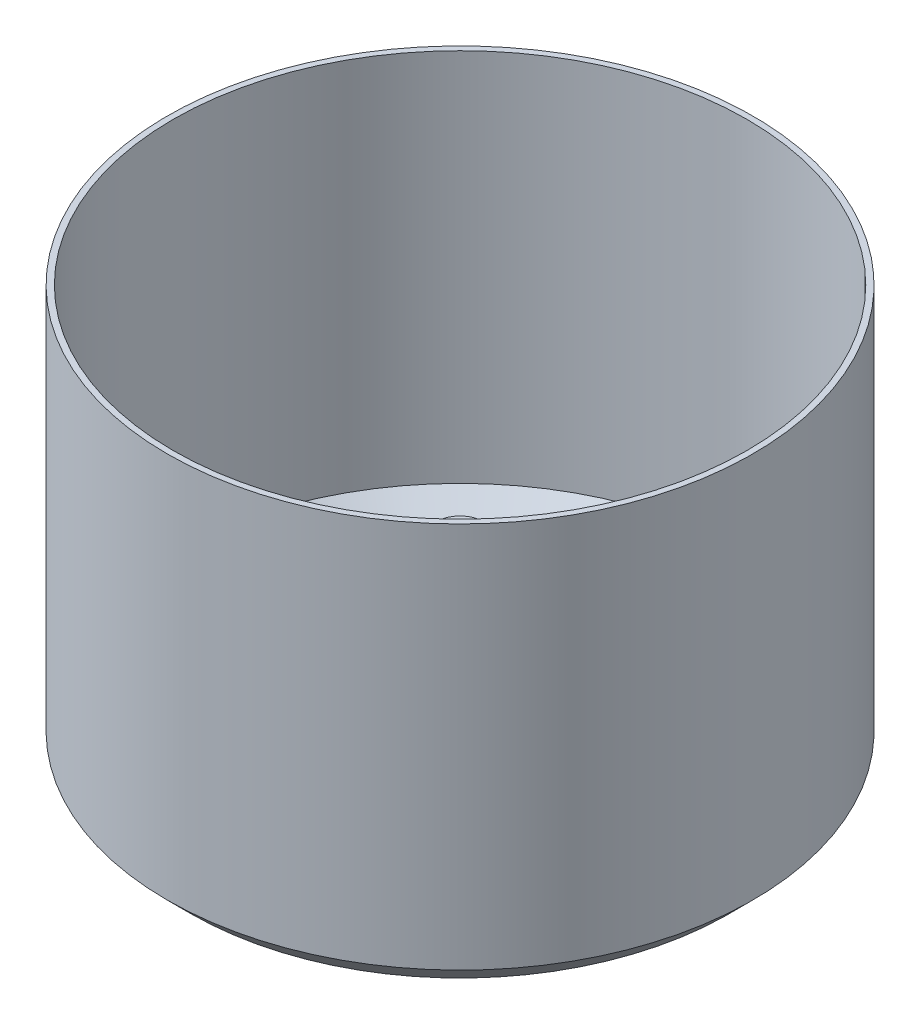
ISO-10303-21;
HEADER;
FILE_DESCRIPTION(('STEP AP214'),'2;1');
FILE_NAME('part.step','',(''),(''),'','','');
FILE_SCHEMA(('AUTOMOTIVE_DESIGN { 1 0 10303 214 1 1 1 1 }'));
ENDSEC;
DATA;
#1=APPLICATION_CONTEXT('core data for automotive mechanical design processes');
#2=APPLICATION_PROTOCOL_DEFINITION('international standard','automotive_design',2000,#1);
#3=PRODUCT_CONTEXT('',#1,'mechanical');
#4=PRODUCT('Part','Part','',(#3));
#5=PRODUCT_RELATED_PRODUCT_CATEGORY('part','',(#4));
#6=PRODUCT_DEFINITION_FORMATION('','',#4);
#7=PRODUCT_DEFINITION_CONTEXT('part definition',#1,'design');
#8=PRODUCT_DEFINITION('design','',#6,#7);
#9=PRODUCT_DEFINITION_SHAPE('','',#8);
#10=(LENGTH_UNIT() NAMED_UNIT(*) SI_UNIT(.MILLI.,.METRE.));
#11=(NAMED_UNIT(*) PLANE_ANGLE_UNIT() SI_UNIT($,.RADIAN.));
#12=(NAMED_UNIT(*) SI_UNIT($,.STERADIAN.) SOLID_ANGLE_UNIT());
#13=UNCERTAINTY_MEASURE_WITH_UNIT(LENGTH_MEASURE(1.E-05),#10,'distance_accuracy_value','');
#14=(GEOMETRIC_REPRESENTATION_CONTEXT(3) GLOBAL_UNCERTAINTY_ASSIGNED_CONTEXT((#13)) GLOBAL_UNIT_ASSIGNED_CONTEXT((#10,
#11,#12)) REPRESENTATION_CONTEXT('',''));
#15=CARTESIAN_POINT('',(0.,0.,0.));
#16=DIRECTION('',(0.,0.,1.));
#17=DIRECTION('',(1.,0.,0.));
#18=AXIS2_PLACEMENT_3D('',#15,#16,#17);
#19=CARTESIAN_POINT('',(0.,70.,0.));
#20=DIRECTION('',(0.,-1.,0.));
#21=DIRECTION('',(0.,0.,-1.));
#22=AXIS2_PLACEMENT_3D('',#19,#20,#21);
#23=CYLINDRICAL_SURFACE('',#22,49.);
#24=CARTESIAN_POINT('',(0.,6.00000000000002,0.));
#25=DIRECTION('',(0.,-1.,0.));
#26=DIRECTION('',(0.,0.,-1.));
#27=AXIS2_PLACEMENT_3D('',#24,#25,#26);
#28=CIRCLE('',#27,49.);
#29=CARTESIAN_POINT('',(0.,6.00000000000002,-49.));
#30=VERTEX_POINT('',#29);
#31=EDGE_CURVE('E107',#30,#30,#28,.T.);
#32=ORIENTED_EDGE('',*,*,#31,.T.);
#33=EDGE_LOOP('',(#32));
#34=FACE_BOUND('',#33,.T.);
#35=CARTESIAN_POINT('',(0.,70.,0.));
#36=DIRECTION('',(0.,1.,0.));
#37=DIRECTION('',(0.,0.,1.));
#38=AXIS2_PLACEMENT_3D('',#35,#36,#37);
#39=CIRCLE('',#38,49.);
#40=CARTESIAN_POINT('',(0.,70.,49.));
#41=VERTEX_POINT('',#40);
#42=EDGE_CURVE('E113',#41,#41,#39,.T.);
#43=ORIENTED_EDGE('',*,*,#42,.T.);
#44=EDGE_LOOP('',(#43));
#45=FACE_BOUND('',#44,.T.);
#46=ADVANCED_FACE('F41',(#34,#45),#23,.F.);
#47=CARTESIAN_POINT('',(0.,70.,0.));
#48=DIRECTION('',(0.,1.,0.));
#49=DIRECTION('',(0.,0.,1.));
#50=AXIS2_PLACEMENT_3D('',#47,#48,#49);
#51=PLANE('',#50);
#52=CARTESIAN_POINT('',(0.,70.,0.));
#53=DIRECTION('',(0.,1.,0.));
#54=DIRECTION('',(0.,0.,1.));
#55=AXIS2_PLACEMENT_3D('',#52,#53,#54);
#56=CIRCLE('',#55,50.);
#57=CARTESIAN_POINT('',(0.,70.,50.));
#58=VERTEX_POINT('',#57);
#59=EDGE_CURVE('E110',#58,#58,#56,.T.);
#60=ORIENTED_EDGE('',*,*,#59,.T.);
#61=EDGE_LOOP('',(#60));
#62=FACE_BOUND('',#61,.T.);
#63=ORIENTED_EDGE('',*,*,#42,.F.);
#64=EDGE_LOOP('',(#63));
#65=FACE_BOUND('',#64,.T.);
#66=ADVANCED_FACE('F118',(#62,#65),#51,.T.);
#67=CARTESIAN_POINT('',(0.,0.,0.));
#68=DIRECTION('',(0.,1.,0.));
#69=DIRECTION('',(0.,0.,1.));
#70=AXIS2_PLACEMENT_3D('',#67,#68,#69);
#71=PLANE('',#70);
#72=CARTESIAN_POINT('',(0.,0.,0.));
#73=DIRECTION('',(0.,1.,0.));
#74=DIRECTION('',(0.,0.,1.));
#75=AXIS2_PLACEMENT_3D('',#72,#73,#74);
#76=CIRCLE('',#75,46.);
#77=CARTESIAN_POINT('',(0.,0.,46.));
#78=VERTEX_POINT('',#77);
#79=EDGE_CURVE('E98',#78,#78,#76,.F.);
#80=ORIENTED_EDGE('',*,*,#79,.T.);
#81=EDGE_LOOP('',(#80));
#82=FACE_BOUND('',#81,.T.);
#83=ADVANCED_FACE('F120',(#82),#71,.F.);
#84=CARTESIAN_POINT('',(0.,70.,0.));
#85=DIRECTION('',(0.,-1.,0.));
#86=DIRECTION('',(0.,0.,-1.));
#87=AXIS2_PLACEMENT_3D('',#84,#85,#86);
#88=CYLINDRICAL_SURFACE('',#87,50.);
#89=CARTESIAN_POINT('',(0.,4.,0.));
#90=DIRECTION('',(0.,1.,0.));
#91=DIRECTION('',(0.,0.,1.));
#92=AXIS2_PLACEMENT_3D('',#89,#90,#91);
#93=CIRCLE('',#92,50.);
#94=CARTESIAN_POINT('',(0.,4.,50.));
#95=VERTEX_POINT('',#94);
#96=EDGE_CURVE('E101',#95,#95,#93,.T.);
#97=ORIENTED_EDGE('',*,*,#96,.T.);
#98=EDGE_LOOP('',(#97));
#99=FACE_BOUND('',#98,.T.);
#100=ORIENTED_EDGE('',*,*,#59,.F.);
#101=EDGE_LOOP('',(#100));
#102=FACE_BOUND('',#101,.T.);
#103=ADVANCED_FACE('F127',(#99,#102),#88,.T.);
#104=CARTESIAN_POINT('',(0.,2.,0.));
#105=DIRECTION('',(0.,-1.,0.));
#106=DIRECTION('',(0.,0.,-1.));
#107=AXIS2_PLACEMENT_3D('',#104,#105,#106);
#108=PLANE('',#107);
#109=CARTESIAN_POINT('',(21.,2.,21.));
#110=DIRECTION('',(0.,-1.,0.));
#111=DIRECTION('',(0.,0.,-1.));
#112=AXIS2_PLACEMENT_3D('',#109,#110,#111);
#113=CIRCLE('',#112,5.99999999999998);
#114=CARTESIAN_POINT('',(21.,2.,15.));
#115=VERTEX_POINT('',#114);
#116=EDGE_CURVE('E57',#115,#115,#113,.T.);
#117=ORIENTED_EDGE('',*,*,#116,.T.);
#118=EDGE_LOOP('',(#117));
#119=FACE_BOUND('',#118,.T.);
#120=CARTESIAN_POINT('',(21.,2.,-21.));
#121=DIRECTION('',(0.,-1.,0.));
#122=DIRECTION('',(0.,0.,-1.));
#123=AXIS2_PLACEMENT_3D('',#120,#121,#122);
#124=CIRCLE('',#123,5.99999999999998);
#125=CARTESIAN_POINT('',(21.,2.,-27.));
#126=VERTEX_POINT('',#125);
#127=EDGE_CURVE('E62',#126,#126,#124,.T.);
#128=ORIENTED_EDGE('',*,*,#127,.T.);
#129=EDGE_LOOP('',(#128));
#130=FACE_BOUND('',#129,.T.);
#131=CARTESIAN_POINT('',(-21.,2.,21.));
#132=DIRECTION('',(0.,-1.,0.));
#133=DIRECTION('',(0.,0.,-1.));
#134=AXIS2_PLACEMENT_3D('',#131,#132,#133);
#135=CIRCLE('',#134,5.99999999999998);
#136=CARTESIAN_POINT('',(-21.,2.,15.));
#137=VERTEX_POINT('',#136);
#138=EDGE_CURVE('E65',#137,#137,#135,.T.);
#139=ORIENTED_EDGE('',*,*,#138,.T.);
#140=EDGE_LOOP('',(#139));
#141=FACE_BOUND('',#140,.T.);
#142=CARTESIAN_POINT('',(-21.,2.,-21.));
#143=DIRECTION('',(0.,-1.,0.));
#144=DIRECTION('',(0.,0.,-1.));
#145=AXIS2_PLACEMENT_3D('',#142,#143,#144);
#146=CIRCLE('',#145,5.99999999999998);
#147=CARTESIAN_POINT('',(-21.,2.,-27.));
#148=VERTEX_POINT('',#147);
#149=EDGE_CURVE('E68',#148,#148,#146,.T.);
#150=ORIENTED_EDGE('',*,*,#149,.T.);
#151=EDGE_LOOP('',(#150));
#152=FACE_BOUND('',#151,.T.);
#153=CARTESIAN_POINT('',(0.,2.,0.));
#154=DIRECTION('',(0.,-1.,0.));
#155=DIRECTION('',(0.,0.,-1.));
#156=AXIS2_PLACEMENT_3D('',#153,#154,#155);
#157=CIRCLE('',#156,45.);
#158=CARTESIAN_POINT('',(0.,2.,-45.));
#159=VERTEX_POINT('',#158);
#160=EDGE_CURVE('E104',#159,#159,#157,.F.);
#161=ORIENTED_EDGE('',*,*,#160,.T.);
#162=EDGE_LOOP('',(#161));
#163=FACE_BOUND('',#162,.T.);
#164=ADVANCED_FACE('F136',(#119,#130,#141,#152,#163),#108,.F.);
#165=CARTESIAN_POINT('',(0.,6.00000000000002,0.));
#166=DIRECTION('',(0.,1.,0.));
#167=DIRECTION('',(0.,0.,1.));
#168=AXIS2_PLACEMENT_3D('',#165,#166,#167);
#169=CONICAL_SURFACE('',#168,49.,0.785398163397444);
#170=ORIENTED_EDGE('',*,*,#160,.F.);
#171=EDGE_LOOP('',(#170));
#172=FACE_BOUND('',#171,.T.);
#173=ORIENTED_EDGE('',*,*,#31,.F.);
#174=EDGE_LOOP('',(#173));
#175=FACE_BOUND('',#174,.T.);
#176=ADVANCED_FACE('F139',(#172,#175),#169,.F.);
#177=CARTESIAN_POINT('',(0.,4.,0.));
#178=DIRECTION('',(0.,1.,0.));
#179=DIRECTION('',(0.,0.,1.));
#180=AXIS2_PLACEMENT_3D('',#177,#178,#179);
#181=CONICAL_SURFACE('',#180,50.,0.785398163397452);
#182=ORIENTED_EDGE('',*,*,#79,.F.);
#183=EDGE_LOOP('',(#182));
#184=FACE_BOUND('',#183,.T.);
#185=ORIENTED_EDGE('',*,*,#96,.F.);
#186=EDGE_LOOP('',(#185));
#187=FACE_BOUND('',#186,.T.);
#188=ADVANCED_FACE('F145',(#184,#187),#181,.T.);
#189=CARTESIAN_POINT('',(-21.,12.,-21.));
#190=DIRECTION('',(0.,-1.,0.));
#191=DIRECTION('',(0.,0.,-1.));
#192=AXIS2_PLACEMENT_3D('',#189,#190,#191);
#193=CYLINDRICAL_SURFACE('',#192,5.);
#194=CARTESIAN_POINT('',(-21.,2.99999999999997,-21.));
#195=DIRECTION('',(0.,-1.,0.));
#196=DIRECTION('',(0.,0.,-1.));
#197=AXIS2_PLACEMENT_3D('',#194,#195,#196);
#198=CIRCLE('',#197,5.);
#199=CARTESIAN_POINT('',(-21.,2.99999999999997,-26.));
#200=VERTEX_POINT('',#199);
#201=EDGE_CURVE('E10',#200,#200,#198,.F.);
#202=ORIENTED_EDGE('',*,*,#201,.T.);
#203=EDGE_LOOP('',(#202));
#204=FACE_BOUND('',#203,.T.);
#205=CARTESIAN_POINT('',(-21.,11.,-21.));
#206=DIRECTION('',(0.,1.,0.));
#207=DIRECTION('',(0.,0.,1.));
#208=AXIS2_PLACEMENT_3D('',#205,#206,#207);
#209=CIRCLE('',#208,5.);
#210=CARTESIAN_POINT('',(-21.,11.,-16.));
#211=VERTEX_POINT('',#210);
#212=EDGE_CURVE('E74',#211,#211,#209,.F.);
#213=ORIENTED_EDGE('',*,*,#212,.T.);
#214=EDGE_LOOP('',(#213));
#215=FACE_BOUND('',#214,.T.);
#216=ADVANCED_FACE('F152',(#204,#215),#193,.T.);
#217=CARTESIAN_POINT('',(-21.,12.,-21.));
#218=DIRECTION('',(0.,1.,0.));
#219=DIRECTION('',(0.,0.,1.));
#220=AXIS2_PLACEMENT_3D('',#217,#218,#219);
#221=PLANE('',#220);
#222=CARTESIAN_POINT('',(-21.,12.,-21.));
#223=DIRECTION('',(0.,1.,0.));
#224=DIRECTION('',(0.,0.,1.));
#225=AXIS2_PLACEMENT_3D('',#222,#223,#224);
#226=CIRCLE('',#225,3.99999999999999);
#227=CARTESIAN_POINT('',(-21.,12.,-17.));
#228=VERTEX_POINT('',#227);
#229=EDGE_CURVE('E77',#228,#228,#226,.T.);
#230=ORIENTED_EDGE('',*,*,#229,.T.);
#231=EDGE_LOOP('',(#230));
#232=FACE_BOUND('',#231,.T.);
#233=ADVANCED_FACE('F223',(#232),#221,.T.);
#234=CARTESIAN_POINT('',(21.,12.,-21.));
#235=DIRECTION('',(0.,-1.,0.));
#236=DIRECTION('',(0.,0.,-1.));
#237=AXIS2_PLACEMENT_3D('',#234,#235,#236);
#238=CYLINDRICAL_SURFACE('',#237,5.);
#239=CARTESIAN_POINT('',(21.,2.99999999999997,-21.));
#240=DIRECTION('',(0.,-1.,0.));
#241=DIRECTION('',(0.,0.,-1.));
#242=AXIS2_PLACEMENT_3D('',#239,#240,#241);
#243=CIRCLE('',#242,5.);
#244=CARTESIAN_POINT('',(21.,2.99999999999997,-26.));
#245=VERTEX_POINT('',#244);
#246=EDGE_CURVE('E53',#245,#245,#243,.F.);
#247=ORIENTED_EDGE('',*,*,#246,.T.);
#248=EDGE_LOOP('',(#247));
#249=FACE_BOUND('',#248,.T.);
#250=CARTESIAN_POINT('',(21.,11.,-21.));
#251=DIRECTION('',(0.,1.,0.));
#252=DIRECTION('',(0.,0.,1.));
#253=AXIS2_PLACEMENT_3D('',#250,#251,#252);
#254=CIRCLE('',#253,5.);
#255=CARTESIAN_POINT('',(21.,11.,-16.));
#256=VERTEX_POINT('',#255);
#257=EDGE_CURVE('E80',#256,#256,#254,.F.);
#258=ORIENTED_EDGE('',*,*,#257,.T.);
#259=EDGE_LOOP('',(#258));
#260=FACE_BOUND('',#259,.T.);
#261=ADVANCED_FACE('F226',(#249,#260),#238,.T.);
#262=CARTESIAN_POINT('',(21.,12.,-21.));
#263=DIRECTION('',(0.,1.,0.));
#264=DIRECTION('',(0.,0.,1.));
#265=AXIS2_PLACEMENT_3D('',#262,#263,#264);
#266=PLANE('',#265);
#267=CARTESIAN_POINT('',(21.,12.,-21.));
#268=DIRECTION('',(0.,1.,0.));
#269=DIRECTION('',(0.,0.,1.));
#270=AXIS2_PLACEMENT_3D('',#267,#268,#269);
#271=CIRCLE('',#270,3.99999999999999);
#272=CARTESIAN_POINT('',(21.,12.,-17.));
#273=VERTEX_POINT('',#272);
#274=EDGE_CURVE('E83',#273,#273,#271,.T.);
#275=ORIENTED_EDGE('',*,*,#274,.T.);
#276=EDGE_LOOP('',(#275));
#277=FACE_BOUND('',#276,.T.);
#278=ADVANCED_FACE('F228',(#277),#266,.T.);
#279=CARTESIAN_POINT('',(21.,12.,21.));
#280=DIRECTION('',(0.,-1.,0.));
#281=DIRECTION('',(0.,0.,-1.));
#282=AXIS2_PLACEMENT_3D('',#279,#280,#281);
#283=CYLINDRICAL_SURFACE('',#282,5.);
#284=CARTESIAN_POINT('',(21.,2.99999999999996,21.));
#285=DIRECTION('',(0.,-1.,0.));
#286=DIRECTION('',(0.,0.,-1.));
#287=AXIS2_PLACEMENT_3D('',#284,#285,#286);
#288=CIRCLE('',#287,5.);
#289=CARTESIAN_POINT('',(21.,2.99999999999996,16.));
#290=VERTEX_POINT('',#289);
#291=EDGE_CURVE('E71',#290,#290,#288,.F.);
#292=ORIENTED_EDGE('',*,*,#291,.T.);
#293=EDGE_LOOP('',(#292));
#294=FACE_BOUND('',#293,.T.);
#295=CARTESIAN_POINT('',(21.,11.,21.));
#296=DIRECTION('',(0.,1.,0.));
#297=DIRECTION('',(0.,0.,1.));
#298=AXIS2_PLACEMENT_3D('',#295,#296,#297);
#299=CIRCLE('',#298,5.);
#300=CARTESIAN_POINT('',(21.,11.,26.));
#301=VERTEX_POINT('',#300);
#302=EDGE_CURVE('E86',#301,#301,#299,.F.);
#303=ORIENTED_EDGE('',*,*,#302,.T.);
#304=EDGE_LOOP('',(#303));
#305=FACE_BOUND('',#304,.T.);
#306=ADVANCED_FACE('F231',(#294,#305),#283,.T.);
#307=CARTESIAN_POINT('',(21.,12.,21.));
#308=DIRECTION('',(0.,1.,0.));
#309=DIRECTION('',(0.,0.,1.));
#310=AXIS2_PLACEMENT_3D('',#307,#308,#309);
#311=PLANE('',#310);
#312=CARTESIAN_POINT('',(21.,12.,21.));
#313=DIRECTION('',(0.,1.,0.));
#314=DIRECTION('',(0.,0.,1.));
#315=AXIS2_PLACEMENT_3D('',#312,#313,#314);
#316=CIRCLE('',#315,4.00000000000003);
#317=CARTESIAN_POINT('',(21.,12.,25.));
#318=VERTEX_POINT('',#317);
#319=EDGE_CURVE('E89',#318,#318,#316,.T.);
#320=ORIENTED_EDGE('',*,*,#319,.T.);
#321=EDGE_LOOP('',(#320));
#322=FACE_BOUND('',#321,.T.);
#323=ADVANCED_FACE('F236',(#322),#311,.T.);
#324=CARTESIAN_POINT('',(-21.,12.,21.));
#325=DIRECTION('',(0.,-1.,0.));
#326=DIRECTION('',(0.,0.,-1.));
#327=AXIS2_PLACEMENT_3D('',#324,#325,#326);
#328=CYLINDRICAL_SURFACE('',#327,5.);
#329=CARTESIAN_POINT('',(-21.,2.99999999999996,21.));
#330=DIRECTION('',(0.,-1.,0.));
#331=DIRECTION('',(0.,0.,-1.));
#332=AXIS2_PLACEMENT_3D('',#329,#330,#331);
#333=CIRCLE('',#332,5.);
#334=CARTESIAN_POINT('',(-21.,2.99999999999996,16.));
#335=VERTEX_POINT('',#334);
#336=EDGE_CURVE('E49',#335,#335,#333,.F.);
#337=ORIENTED_EDGE('',*,*,#336,.T.);
#338=EDGE_LOOP('',(#337));
#339=FACE_BOUND('',#338,.T.);
#340=CARTESIAN_POINT('',(-21.,11.,21.));
#341=DIRECTION('',(0.,1.,0.));
#342=DIRECTION('',(0.,0.,1.));
#343=AXIS2_PLACEMENT_3D('',#340,#341,#342);
#344=CIRCLE('',#343,5.);
#345=CARTESIAN_POINT('',(-21.,11.,26.));
#346=VERTEX_POINT('',#345);
#347=EDGE_CURVE('E92',#346,#346,#344,.F.);
#348=ORIENTED_EDGE('',*,*,#347,.T.);
#349=EDGE_LOOP('',(#348));
#350=FACE_BOUND('',#349,.T.);
#351=ADVANCED_FACE('F239',(#339,#350),#328,.T.);
#352=CARTESIAN_POINT('',(-21.,12.,21.));
#353=DIRECTION('',(0.,1.,0.));
#354=DIRECTION('',(0.,0.,1.));
#355=AXIS2_PLACEMENT_3D('',#352,#353,#354);
#356=PLANE('',#355);
#357=CARTESIAN_POINT('',(-21.,12.,21.));
#358=DIRECTION('',(0.,1.,0.));
#359=DIRECTION('',(0.,0.,1.));
#360=AXIS2_PLACEMENT_3D('',#357,#358,#359);
#361=CIRCLE('',#360,4.00000000000003);
#362=CARTESIAN_POINT('',(-21.,12.,25.));
#363=VERTEX_POINT('',#362);
#364=EDGE_CURVE('E95',#363,#363,#361,.T.);
#365=ORIENTED_EDGE('',*,*,#364,.T.);
#366=EDGE_LOOP('',(#365));
#367=FACE_BOUND('',#366,.T.);
#368=ADVANCED_FACE('F161',(#367),#356,.T.);
#369=CARTESIAN_POINT('',(-21.,12.,21.));
#370=DIRECTION('',(0.,-1.,0.));
#371=DIRECTION('',(0.,0.,-1.));
#372=AXIS2_PLACEMENT_3D('',#369,#370,#371);
#373=CONICAL_SURFACE('',#372,4.00000000000003,0.785398163397447);
#374=ORIENTED_EDGE('',*,*,#347,.F.);
#375=EDGE_LOOP('',(#374));
#376=FACE_BOUND('',#375,.T.);
#377=ORIENTED_EDGE('',*,*,#364,.F.);
#378=EDGE_LOOP('',(#377));
#379=FACE_BOUND('',#378,.T.);
#380=ADVANCED_FACE('F154',(#376,#379),#373,.T.);
#381=CARTESIAN_POINT('',(21.,12.,21.));
#382=DIRECTION('',(0.,-1.,0.));
#383=DIRECTION('',(0.,0.,-1.));
#384=AXIS2_PLACEMENT_3D('',#381,#382,#383);
#385=CONICAL_SURFACE('',#384,4.00000000000003,0.785398163397447);
#386=ORIENTED_EDGE('',*,*,#302,.F.);
#387=EDGE_LOOP('',(#386));
#388=FACE_BOUND('',#387,.T.);
#389=ORIENTED_EDGE('',*,*,#319,.F.);
#390=EDGE_LOOP('',(#389));
#391=FACE_BOUND('',#390,.T.);
#392=ADVANCED_FACE('F160',(#388,#391),#385,.T.);
#393=CARTESIAN_POINT('',(21.,12.,-21.));
#394=DIRECTION('',(0.,-1.,0.));
#395=DIRECTION('',(0.,0.,-1.));
#396=AXIS2_PLACEMENT_3D('',#393,#394,#395);
#397=CONICAL_SURFACE('',#396,3.99999999999999,0.785398163397447);
#398=ORIENTED_EDGE('',*,*,#257,.F.);
#399=EDGE_LOOP('',(#398));
#400=FACE_BOUND('',#399,.T.);
#401=ORIENTED_EDGE('',*,*,#274,.F.);
#402=EDGE_LOOP('',(#401));
#403=FACE_BOUND('',#402,.T.);
#404=ADVANCED_FACE('F168',(#400,#403),#397,.T.);
#405=CARTESIAN_POINT('',(-21.,12.,-21.));
#406=DIRECTION('',(0.,-1.,0.));
#407=DIRECTION('',(0.,0.,-1.));
#408=AXIS2_PLACEMENT_3D('',#405,#406,#407);
#409=CONICAL_SURFACE('',#408,3.99999999999999,0.785398163397447);
#410=ORIENTED_EDGE('',*,*,#212,.F.);
#411=EDGE_LOOP('',(#410));
#412=FACE_BOUND('',#411,.T.);
#413=ORIENTED_EDGE('',*,*,#229,.F.);
#414=EDGE_LOOP('',(#413));
#415=FACE_BOUND('',#414,.T.);
#416=ADVANCED_FACE('F175',(#412,#415),#409,.T.);
#417=CARTESIAN_POINT('',(21.,2.99999999999996,21.));
#418=DIRECTION('',(0.,-1.,0.));
#419=DIRECTION('',(0.,0.,-1.));
#420=AXIS2_PLACEMENT_3D('',#417,#418,#419);
#421=CONICAL_SURFACE('',#420,5.,0.785398163397454);
#422=ORIENTED_EDGE('',*,*,#116,.F.);
#423=EDGE_LOOP('',(#422));
#424=FACE_BOUND('',#423,.T.);
#425=ORIENTED_EDGE('',*,*,#291,.F.);
#426=EDGE_LOOP('',(#425));
#427=FACE_BOUND('',#426,.T.);
#428=ADVANCED_FACE('F182',(#424,#427),#421,.T.);
#429=CARTESIAN_POINT('',(21.,2.99999999999997,-21.));
#430=DIRECTION('',(0.,-1.,0.));
#431=DIRECTION('',(0.,0.,-1.));
#432=AXIS2_PLACEMENT_3D('',#429,#430,#431);
#433=CONICAL_SURFACE('',#432,5.,0.785398163397453);
#434=ORIENTED_EDGE('',*,*,#127,.F.);
#435=EDGE_LOOP('',(#434));
#436=FACE_BOUND('',#435,.T.);
#437=ORIENTED_EDGE('',*,*,#246,.F.);
#438=EDGE_LOOP('',(#437));
#439=FACE_BOUND('',#438,.T.);
#440=ADVANCED_FACE('F189',(#436,#439),#433,.T.);
#441=CARTESIAN_POINT('',(-21.,2.99999999999996,21.));
#442=DIRECTION('',(0.,-1.,0.));
#443=DIRECTION('',(0.,0.,-1.));
#444=AXIS2_PLACEMENT_3D('',#441,#442,#443);
#445=CONICAL_SURFACE('',#444,5.,0.785398163397454);
#446=ORIENTED_EDGE('',*,*,#138,.F.);
#447=EDGE_LOOP('',(#446));
#448=FACE_BOUND('',#447,.T.);
#449=ORIENTED_EDGE('',*,*,#336,.F.);
#450=EDGE_LOOP('',(#449));
#451=FACE_BOUND('',#450,.T.);
#452=ADVANCED_FACE('F195',(#448,#451),#445,.T.);
#453=CARTESIAN_POINT('',(-21.,2.99999999999997,-21.));
#454=DIRECTION('',(0.,-1.,0.));
#455=DIRECTION('',(0.,0.,-1.));
#456=AXIS2_PLACEMENT_3D('',#453,#454,#455);
#457=CONICAL_SURFACE('',#456,5.,0.785398163397453);
#458=ORIENTED_EDGE('',*,*,#149,.F.);
#459=EDGE_LOOP('',(#458));
#460=FACE_BOUND('',#459,.T.);
#461=ORIENTED_EDGE('',*,*,#201,.F.);
#462=EDGE_LOOP('',(#461));
#463=FACE_BOUND('',#462,.T.);
#464=ADVANCED_FACE('F44',(#460,#463),#457,.T.);
#465=CLOSED_SHELL('',(#46,#66,#83,#103,#164,#176,#188,#216,#233,#261,#278,#306,#323,#351,#368,
#380,#392,#404,#416,#428,#440,#452,#464));
#466=MANIFOLD_SOLID_BREP('B2',#465);
#467=ADVANCED_BREP_SHAPE_REPRESENTATION('',(#18,#466),#14);
#468=SHAPE_DEFINITION_REPRESENTATION(#9,#467);
ENDSEC;
END-ISO-10303-21;
